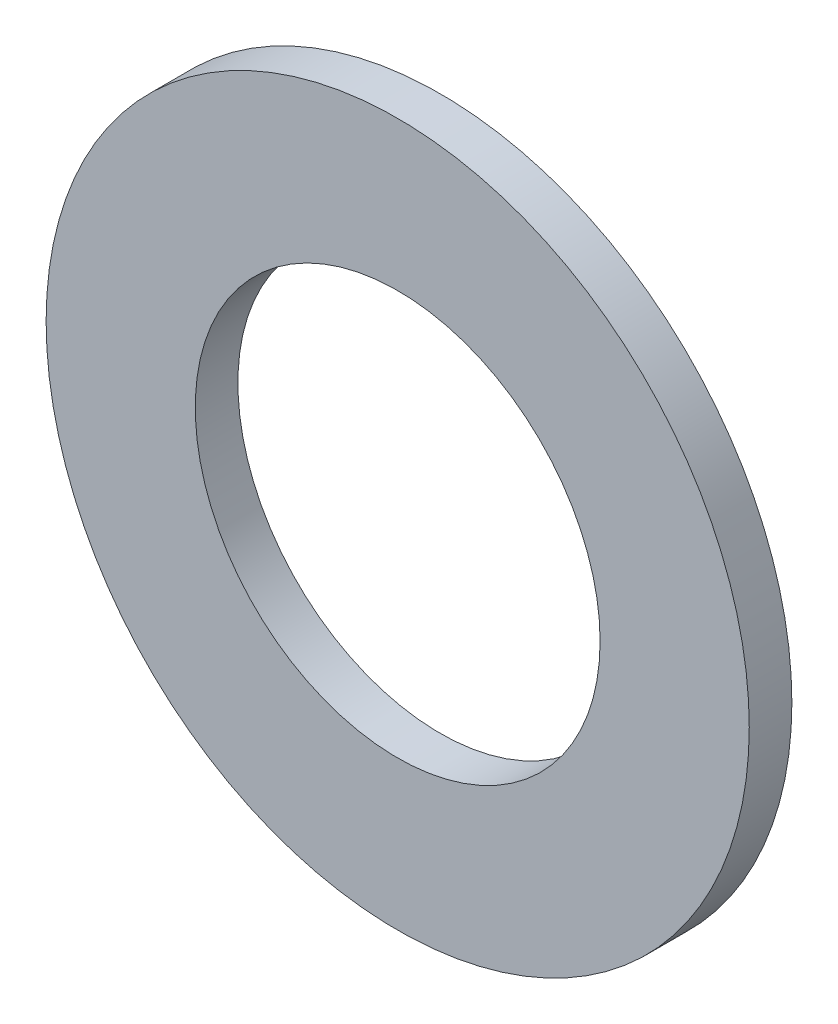
ISO-10303-21;
HEADER;
FILE_DESCRIPTION(('STEP AP214'),'2;1');
FILE_NAME('part.step','',(''),(''),'','','');
FILE_SCHEMA(('AUTOMOTIVE_DESIGN { 1 0 10303 214 1 1 1 1 }'));
ENDSEC;
DATA;
#1=APPLICATION_CONTEXT('core data for automotive mechanical design processes');
#2=APPLICATION_PROTOCOL_DEFINITION('international standard','automotive_design',2000,#1);
#3=PRODUCT_CONTEXT('',#1,'mechanical');
#4=PRODUCT('Part','Part','',(#3));
#5=PRODUCT_RELATED_PRODUCT_CATEGORY('part','',(#4));
#6=PRODUCT_DEFINITION_FORMATION('','',#4);
#7=PRODUCT_DEFINITION_CONTEXT('part definition',#1,'design');
#8=PRODUCT_DEFINITION('design','',#6,#7);
#9=PRODUCT_DEFINITION_SHAPE('','',#8);
#10=(LENGTH_UNIT() NAMED_UNIT(*) SI_UNIT(.MILLI.,.METRE.));
#11=(NAMED_UNIT(*) PLANE_ANGLE_UNIT() SI_UNIT($,.RADIAN.));
#12=(NAMED_UNIT(*) SI_UNIT($,.STERADIAN.) SOLID_ANGLE_UNIT());
#13=UNCERTAINTY_MEASURE_WITH_UNIT(LENGTH_MEASURE(1.E-05),#10,'distance_accuracy_value','');
#14=(GEOMETRIC_REPRESENTATION_CONTEXT(3) GLOBAL_UNCERTAINTY_ASSIGNED_CONTEXT((#13)) GLOBAL_UNIT_ASSIGNED_CONTEXT((#10,
#11,#12)) REPRESENTATION_CONTEXT('',''));
#15=CARTESIAN_POINT('',(0.,0.,0.));
#16=DIRECTION('',(0.,0.,1.));
#17=DIRECTION('',(1.,0.,0.));
#18=AXIS2_PLACEMENT_3D('',#15,#16,#17);
#19=CARTESIAN_POINT('',(0.,0.,-2.032));
#20=DIRECTION('',(0.,0.,1.));
#21=DIRECTION('',(1.,0.,0.));
#22=AXIS2_PLACEMENT_3D('',#19,#20,#21);
#23=CYLINDRICAL_SURFACE('',#22,16.764);
#24=CARTESIAN_POINT('',(0.,0.,-2.032));
#25=DIRECTION('',(0.,0.,1.));
#26=DIRECTION('',(1.,0.,0.));
#27=AXIS2_PLACEMENT_3D('',#24,#25,#26);
#28=CIRCLE('',#27,16.764);
#29=CARTESIAN_POINT('',(16.764,0.,-2.032));
#30=VERTEX_POINT('',#29);
#31=EDGE_CURVE('E10',#30,#30,#28,.T.);
#32=ORIENTED_EDGE('',*,*,#31,.T.);
#33=EDGE_LOOP('',(#32));
#34=FACE_BOUND('',#33,.T.);
#35=CARTESIAN_POINT('',(0.,0.,0.));
#36=DIRECTION('',(0.,0.,1.));
#37=DIRECTION('',(1.,0.,0.));
#38=AXIS2_PLACEMENT_3D('',#35,#36,#37);
#39=CIRCLE('',#38,16.764);
#40=CARTESIAN_POINT('',(16.764,0.,0.));
#41=VERTEX_POINT('',#40);
#42=EDGE_CURVE('E35',#41,#41,#39,.T.);
#43=ORIENTED_EDGE('',*,*,#42,.F.);
#44=EDGE_LOOP('',(#43));
#45=FACE_BOUND('',#44,.T.);
#46=ADVANCED_FACE('F32',(#34,#45),#23,.T.);
#47=CARTESIAN_POINT('',(0.,0.,-2.032));
#48=DIRECTION('',(0.,0.,1.));
#49=DIRECTION('',(1.,0.,0.));
#50=AXIS2_PLACEMENT_3D('',#47,#48,#49);
#51=PLANE('',#50);
#52=CARTESIAN_POINT('',(0.,0.,-2.032));
#53=DIRECTION('',(0.,0.,1.));
#54=DIRECTION('',(1.,0.,0.));
#55=AXIS2_PLACEMENT_3D('',#52,#53,#54);
#56=CIRCLE('',#55,9.652);
#57=CARTESIAN_POINT('',(9.652,0.,-2.032));
#58=VERTEX_POINT('',#57);
#59=EDGE_CURVE('E42',#58,#58,#56,.T.);
#60=ORIENTED_EDGE('',*,*,#59,.T.);
#61=EDGE_LOOP('',(#60));
#62=FACE_BOUND('',#61,.T.);
#63=ORIENTED_EDGE('',*,*,#31,.F.);
#64=EDGE_LOOP('',(#63));
#65=FACE_BOUND('',#64,.T.);
#66=ADVANCED_FACE('F50',(#62,#65),#51,.F.);
#67=CARTESIAN_POINT('',(0.,0.,0.));
#68=DIRECTION('',(0.,0.,1.));
#69=DIRECTION('',(1.,0.,0.));
#70=AXIS2_PLACEMENT_3D('',#67,#68,#69);
#71=PLANE('',#70);
#72=CARTESIAN_POINT('',(0.,0.,0.));
#73=DIRECTION('',(0.,0.,1.));
#74=DIRECTION('',(1.,0.,0.));
#75=AXIS2_PLACEMENT_3D('',#72,#73,#74);
#76=CIRCLE('',#75,9.652);
#77=CARTESIAN_POINT('',(9.652,0.,0.));
#78=VERTEX_POINT('',#77);
#79=EDGE_CURVE('E44',#78,#78,#76,.T.);
#80=ORIENTED_EDGE('',*,*,#79,.F.);
#81=EDGE_LOOP('',(#80));
#82=FACE_BOUND('',#81,.T.);
#83=ORIENTED_EDGE('',*,*,#42,.T.);
#84=EDGE_LOOP('',(#83));
#85=FACE_BOUND('',#84,.T.);
#86=ADVANCED_FACE('F56',(#82,#85),#71,.T.);
#87=CARTESIAN_POINT('',(0.,0.,-2.032));
#88=DIRECTION('',(0.,0.,1.));
#89=DIRECTION('',(1.,0.,0.));
#90=AXIS2_PLACEMENT_3D('',#87,#88,#89);
#91=CYLINDRICAL_SURFACE('',#90,9.652);
#92=ORIENTED_EDGE('',*,*,#59,.F.);
#93=EDGE_LOOP('',(#92));
#94=FACE_BOUND('',#93,.T.);
#95=ORIENTED_EDGE('',*,*,#79,.T.);
#96=EDGE_LOOP('',(#95));
#97=FACE_BOUND('',#96,.T.);
#98=ADVANCED_FACE('F53',(#94,#97),#91,.F.);
#99=CLOSED_SHELL('',(#46,#66,#86,#98));
#100=MANIFOLD_SOLID_BREP('B2',#99);
#101=ADVANCED_BREP_SHAPE_REPRESENTATION('',(#18,#100),#14);
#102=SHAPE_DEFINITION_REPRESENTATION(#9,#101);
ENDSEC;
END-ISO-10303-21;
